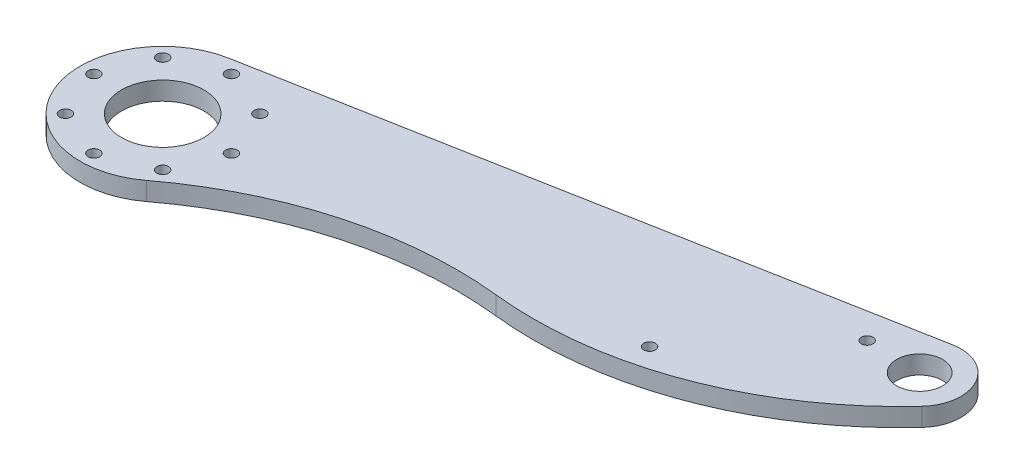
ISO-10303-21;
HEADER;
FILE_DESCRIPTION(('STEP AP214'),'2;1');
FILE_NAME('part.step','',(''),(''),'','','');
FILE_SCHEMA(('AUTOMOTIVE_DESIGN { 1 0 10303 214 1 1 1 1 }'));
ENDSEC;
DATA;
#1=APPLICATION_CONTEXT('core data for automotive mechanical design processes');
#2=APPLICATION_PROTOCOL_DEFINITION('international standard','automotive_design',2000,#1);
#3=PRODUCT_CONTEXT('',#1,'mechanical');
#4=PRODUCT('Part','Part','',(#3));
#5=PRODUCT_RELATED_PRODUCT_CATEGORY('part','',(#4));
#6=PRODUCT_DEFINITION_FORMATION('','',#4);
#7=PRODUCT_DEFINITION_CONTEXT('part definition',#1,'design');
#8=PRODUCT_DEFINITION('design','',#6,#7);
#9=PRODUCT_DEFINITION_SHAPE('','',#8);
#10=(LENGTH_UNIT() NAMED_UNIT(*) SI_UNIT(.MILLI.,.METRE.));
#11=(NAMED_UNIT(*) PLANE_ANGLE_UNIT() SI_UNIT($,.RADIAN.));
#12=(NAMED_UNIT(*) SI_UNIT($,.STERADIAN.) SOLID_ANGLE_UNIT());
#13=UNCERTAINTY_MEASURE_WITH_UNIT(LENGTH_MEASURE(1.E-05),#10,'distance_accuracy_value','');
#14=(GEOMETRIC_REPRESENTATION_CONTEXT(3) GLOBAL_UNCERTAINTY_ASSIGNED_CONTEXT((#13)) GLOBAL_UNIT_ASSIGNED_CONTEXT((#10,
#11,#12)) REPRESENTATION_CONTEXT('',''));
#15=CARTESIAN_POINT('',(0.,0.,0.));
#16=DIRECTION('',(0.,0.,1.));
#17=DIRECTION('',(1.,0.,0.));
#18=AXIS2_PLACEMENT_3D('',#15,#16,#17);
#19=CARTESIAN_POINT('',(586.595611400945,6.35,-953.504414342364));
#20=DIRECTION('',(0.,-1.,0.));
#21=DIRECTION('',(0.,0.,-1.));
#22=AXIS2_PLACEMENT_3D('',#19,#20,#21);
#23=CYLINDRICAL_SURFACE('',#22,133.350000000003);
#24=CARTESIAN_POINT('',(586.595611400945,0.,-953.504414342364));
#25=DIRECTION('',(0.,1.,0.));
#26=DIRECTION('',(0.,0.,1.));
#27=AXIS2_PLACEMENT_3D('',#24,#25,#26);
#28=CIRCLE('',#27,133.350000000003);
#29=CARTESIAN_POINT('',(600.970668220991,0.,-1086.0773385819));
#30=VERTEX_POINT('',#29);
#31=CARTESIAN_POINT('',(506.18157848252,0.,-1059.8801907663));
#32=VERTEX_POINT('',#31);
#33=EDGE_CURVE('E118',#30,#32,#28,.T.);
#34=ORIENTED_EDGE('',*,*,#33,.F.);
#35=DIRECTION('',(0.,-1.,0.));
#36=VECTOR('',#35,1.);
#37=CARTESIAN_POINT('',(600.970668220991,6.35,-1086.0773385819));
#38=LINE('',#37,#36);
#39=CARTESIAN_POINT('',(600.970668220991,6.35,-1086.0773385819));
#40=VERTEX_POINT('',#39);
#41=EDGE_CURVE('E11',#40,#30,#38,.T.);
#42=ORIENTED_EDGE('',*,*,#41,.F.);
#43=CARTESIAN_POINT('',(586.595611400945,6.35,-953.504414342364));
#44=DIRECTION('',(0.,1.,0.));
#45=DIRECTION('',(0.,0.,1.));
#46=AXIS2_PLACEMENT_3D('',#43,#44,#45);
#47=CIRCLE('',#46,133.350000000003);
#48=CARTESIAN_POINT('',(506.18157848252,6.35,-1059.8801907663));
#49=VERTEX_POINT('',#48);
#50=EDGE_CURVE('E375',#40,#49,#47,.T.);
#51=ORIENTED_EDGE('',*,*,#50,.T.);
#52=DIRECTION('',(0.,-1.,0.));
#53=VECTOR('',#52,1.);
#54=CARTESIAN_POINT('',(506.18157848252,6.35,-1059.8801907663));
#55=LINE('',#54,#53);
#56=EDGE_CURVE('E79',#49,#32,#55,.T.);
#57=ORIENTED_EDGE('',*,*,#56,.T.);
#58=EDGE_LOOP('',(#34,#42,#51,#57));
#59=FACE_BOUND('',#58,.T.);
#60=ADVANCED_FACE('F37',(#59),#23,.F.);
#61=CARTESIAN_POINT('',(614.661198525796,6.35,-1212.33726642907));
#62=DIRECTION('',(0.,-1.,0.));
#63=DIRECTION('',(0.,0.,-1.));
#64=AXIS2_PLACEMENT_3D('',#61,#62,#63);
#65=CYLINDRICAL_SURFACE('',#64,127.);
#66=CARTESIAN_POINT('',(614.661198525796,0.,-1212.33726642907));
#67=DIRECTION('',(0.,1.,0.));
#68=DIRECTION('',(0.,0.,1.));
#69=AXIS2_PLACEMENT_3D('',#66,#67,#68);
#70=CIRCLE('',#69,127.);
#71=CARTESIAN_POINT('',(708.209644565852,0.,-1126.44379610978));
#72=VERTEX_POINT('',#71);
#73=EDGE_CURVE('E121',#30,#72,#70,.T.);
#74=ORIENTED_EDGE('',*,*,#73,.T.);
#75=DIRECTION('',(0.,-1.,0.));
#76=VECTOR('',#75,1.);
#77=CARTESIAN_POINT('',(708.209644565852,6.35,-1126.44379610978));
#78=LINE('',#77,#76);
#79=CARTESIAN_POINT('',(708.209644565852,6.35,-1126.44379610978));
#80=VERTEX_POINT('',#79);
#81=EDGE_CURVE('E46',#80,#72,#78,.T.);
#82=ORIENTED_EDGE('',*,*,#81,.F.);
#83=CARTESIAN_POINT('',(614.661198525796,6.35,-1212.33726642907));
#84=DIRECTION('',(0.,1.,0.));
#85=DIRECTION('',(0.,0.,1.));
#86=AXIS2_PLACEMENT_3D('',#83,#84,#85);
#87=CIRCLE('',#86,127.);
#88=EDGE_CURVE('E93',#40,#80,#87,.T.);
#89=ORIENTED_EDGE('',*,*,#88,.F.);
#90=ORIENTED_EDGE('',*,*,#41,.T.);
#91=EDGE_LOOP('',(#74,#82,#89,#90));
#92=FACE_BOUND('',#91,.T.);
#93=ADVANCED_FACE('F133',(#92),#65,.T.);
#94=CARTESIAN_POINT('',(697.685444386345,6.35,-1136.1068115207));
#95=DIRECTION('',(0.,-1.,0.));
#96=DIRECTION('',(0.,0.,-1.));
#97=AXIS2_PLACEMENT_3D('',#94,#95,#96);
#98=CYLINDRICAL_SURFACE('',#97,14.2874999999999);
#99=CARTESIAN_POINT('',(697.685444386345,0.,-1136.1068115207));
#100=DIRECTION('',(0.,1.,0.));
#101=DIRECTION('',(0.,0.,1.));
#102=AXIS2_PLACEMENT_3D('',#99,#100,#101);
#103=CIRCLE('',#102,14.2874999999999);
#104=CARTESIAN_POINT('',(695.06799528282,0.,-1150.15250895587));
#105=VERTEX_POINT('',#104);
#106=EDGE_CURVE('E101',#72,#105,#103,.T.);
#107=ORIENTED_EDGE('',*,*,#106,.T.);
#108=DIRECTION('',(0.,-1.,0.));
#109=VECTOR('',#108,1.);
#110=CARTESIAN_POINT('',(695.06799528282,6.35,-1150.15250895587));
#111=LINE('',#110,#109);
#112=CARTESIAN_POINT('',(695.06799528282,6.35,-1150.15250895587));
#113=VERTEX_POINT('',#112);
#114=EDGE_CURVE('E99',#113,#105,#111,.T.);
#115=ORIENTED_EDGE('',*,*,#114,.F.);
#116=CARTESIAN_POINT('',(697.685444386345,6.35,-1136.1068115207));
#117=DIRECTION('',(0.,1.,0.));
#118=DIRECTION('',(0.,0.,1.));
#119=AXIS2_PLACEMENT_3D('',#116,#117,#118);
#120=CIRCLE('',#119,14.2874999999999);
#121=EDGE_CURVE('E88',#80,#113,#120,.T.);
#122=ORIENTED_EDGE('',*,*,#121,.F.);
#123=ORIENTED_EDGE('',*,*,#81,.T.);
#124=EDGE_LOOP('',(#107,#115,#122,#123));
#125=FACE_BOUND('',#124,.T.);
#126=ADVANCED_FACE('F100',(#125),#98,.T.);
#127=CARTESIAN_POINT('',(-183.81258487051,6.35,-986.371023754057));
#128=DIRECTION('',(-0.183198537429595,0.,-0.983075935970186));
#129=DIRECTION('',(-0.983075935970186,0.,0.183198537429595));
#130=AXIS2_PLACEMENT_3D('',#127,#128,#129);
#131=PLANE('',#130);
#132=DIRECTION('',(0.983075935970186,0.,-0.183198537429595));
#133=VECTOR('',#132,1.);
#134=CARTESIAN_POINT('',(-183.81258487051,0.,-986.371023754057));
#135=LINE('',#134,#133);
#136=CARTESIAN_POINT('',(483.715101792949,0.,-1110.76639487035));
#137=VERTEX_POINT('',#136);
#138=EDGE_CURVE('E125',#137,#105,#135,.T.);
#139=ORIENTED_EDGE('',*,*,#138,.F.);
#140=DIRECTION('',(0.,-1.,0.));
#141=VECTOR('',#140,1.);
#142=CARTESIAN_POINT('',(483.715101792949,6.35,-1110.76639487035));
#143=LINE('',#142,#141);
#144=CARTESIAN_POINT('',(483.715101792949,6.35,-1110.76639487035));
#145=VERTEX_POINT('',#144);
#146=EDGE_CURVE('E72',#145,#137,#143,.T.);
#147=ORIENTED_EDGE('',*,*,#146,.F.);
#148=DIRECTION('',(0.983075935970186,0.,-0.183198537429595));
#149=VECTOR('',#148,1.);
#150=CARTESIAN_POINT('',(-183.81258487051,6.35,-986.371023754057));
#151=LINE('',#150,#149);
#152=EDGE_CURVE('E92',#145,#113,#151,.T.);
#153=ORIENTED_EDGE('',*,*,#152,.T.);
#154=ORIENTED_EDGE('',*,*,#114,.T.);
#155=EDGE_LOOP('',(#139,#147,#153,#154));
#156=FACE_BOUND('',#155,.T.);
#157=ADVANCED_FACE('F106',(#156),#131,.T.);
#158=CARTESIAN_POINT('',(697.685444386345,6.35,-1136.1068115207));
#159=DIRECTION('',(0.,-1.,0.));
#160=DIRECTION('',(0.,0.,-1.));
#161=AXIS2_PLACEMENT_3D('',#158,#159,#160);
#162=CYLINDRICAL_SURFACE('',#161,7.93750000000277);
#163=CARTESIAN_POINT('',(697.685444386345,6.35,-1136.1068115207));
#164=DIRECTION('',(0.,1.,0.));
#165=DIRECTION('',(0.,0.,1.));
#166=AXIS2_PLACEMENT_3D('',#163,#164,#165);
#167=CIRCLE('',#166,7.93750000000277);
#168=CARTESIAN_POINT('',(697.685444386345,6.35,-1128.1693115207));
#169=VERTEX_POINT('',#168);
#170=EDGE_CURVE('E156',#169,#169,#167,.T.);
#171=ORIENTED_EDGE('',*,*,#170,.T.);
#172=EDGE_LOOP('',(#171));
#173=FACE_BOUND('',#172,.T.);
#174=CARTESIAN_POINT('',(697.685444386345,0.,-1136.1068115207));
#175=DIRECTION('',(0.,1.,0.));
#176=DIRECTION('',(0.,0.,1.));
#177=AXIS2_PLACEMENT_3D('',#174,#175,#176);
#178=CIRCLE('',#177,7.93750000000277);
#179=CARTESIAN_POINT('',(697.685444386345,0.,-1128.1693115207));
#180=VERTEX_POINT('',#179);
#181=EDGE_CURVE('E114',#180,#180,#178,.T.);
#182=ORIENTED_EDGE('',*,*,#181,.F.);
#183=EDGE_LOOP('',(#182));
#184=FACE_BOUND('',#183,.T.);
#185=ADVANCED_FACE('F143',(#173,#184),#162,.F.);
#186=CARTESIAN_POINT('',(488.95,6.35,-1082.675));
#187=DIRECTION('',(0.,-1.,0.));
#188=DIRECTION('',(0.,0.,-1.));
#189=AXIS2_PLACEMENT_3D('',#186,#187,#188);
#190=CYLINDRICAL_SURFACE('',#189,14.2875);
#191=CARTESIAN_POINT('',(488.95,6.35,-1082.675));
#192=DIRECTION('',(0.,1.,0.));
#193=DIRECTION('',(0.,0.,1.));
#194=AXIS2_PLACEMENT_3D('',#191,#192,#193);
#195=CIRCLE('',#194,14.2875);
#196=CARTESIAN_POINT('',(488.95,6.35,-1068.3875));
#197=VERTEX_POINT('',#196);
#198=EDGE_CURVE('E129',#197,#197,#195,.T.);
#199=ORIENTED_EDGE('',*,*,#198,.T.);
#200=EDGE_LOOP('',(#199));
#201=FACE_BOUND('',#200,.T.);
#202=CARTESIAN_POINT('',(488.95,0.,-1082.675));
#203=DIRECTION('',(0.,1.,0.));
#204=DIRECTION('',(0.,0.,1.));
#205=AXIS2_PLACEMENT_3D('',#202,#203,#204);
#206=CIRCLE('',#205,14.2875);
#207=CARTESIAN_POINT('',(488.95,0.,-1068.3875));
#208=VERTEX_POINT('',#207);
#209=EDGE_CURVE('E111',#208,#208,#206,.T.);
#210=ORIENTED_EDGE('',*,*,#209,.F.);
#211=EDGE_LOOP('',(#210));
#212=FACE_BOUND('',#211,.T.);
#213=ADVANCED_FACE('F39',(#201,#212),#190,.F.);
#214=CARTESIAN_POINT('',(488.95,6.35,-1082.675));
#215=DIRECTION('',(0.,-1.,0.));
#216=DIRECTION('',(0.,0.,-1.));
#217=AXIS2_PLACEMENT_3D('',#214,#215,#216);
#218=CYLINDRICAL_SURFACE('',#217,28.5750000000001);
#219=CARTESIAN_POINT('',(488.95,0.,-1082.675));
#220=DIRECTION('',(0.,1.,0.));
#221=DIRECTION('',(0.,0.,1.));
#222=AXIS2_PLACEMENT_3D('',#219,#220,#221);
#223=CIRCLE('',#222,28.5750000000001);
#224=EDGE_CURVE('E127',#137,#32,#223,.T.);
#225=ORIENTED_EDGE('',*,*,#224,.T.);
#226=ORIENTED_EDGE('',*,*,#56,.F.);
#227=CARTESIAN_POINT('',(488.95,6.35,-1082.675));
#228=DIRECTION('',(0.,1.,0.));
#229=DIRECTION('',(0.,0.,1.));
#230=AXIS2_PLACEMENT_3D('',#227,#228,#229);
#231=CIRCLE('',#230,28.5750000000001);
#232=EDGE_CURVE('E54',#145,#49,#231,.T.);
#233=ORIENTED_EDGE('',*,*,#232,.F.);
#234=ORIENTED_EDGE('',*,*,#146,.T.);
#235=EDGE_LOOP('',(#225,#226,#233,#234));
#236=FACE_BOUND('',#235,.T.);
#237=ADVANCED_FACE('F150',(#236),#218,.T.);
#238=CARTESIAN_POINT('',(0.,6.35,0.));
#239=DIRECTION('',(0.,1.,0.));
#240=DIRECTION('',(0.,0.,1.));
#241=AXIS2_PLACEMENT_3D('',#238,#239,#240);
#242=PLANE('',#241);
#243=CARTESIAN_POINT('',(488.95,6.35,-1058.8625));
#244=DIRECTION('',(0.,1.,0.));
#245=DIRECTION('',(0.,0.,1.));
#246=AXIS2_PLACEMENT_3D('',#243,#244,#245);
#247=CIRCLE('',#246,2.01929999999996);
#248=CARTESIAN_POINT('',(488.95,6.35,-1056.8432));
#249=VERTEX_POINT('',#248);
#250=EDGE_CURVE('E314',#249,#249,#247,.T.);
#251=ORIENTED_EDGE('',*,*,#250,.F.);
#252=EDGE_LOOP('',(#251));
#253=FACE_BOUND('',#252,.T.);
#254=CARTESIAN_POINT('',(643.114305474491,6.35,-1097.12171037684));
#255=DIRECTION('',(0.,1.,0.));
#256=DIRECTION('',(0.,0.,1.));
#257=AXIS2_PLACEMENT_3D('',#254,#255,#256);
#258=CIRCLE('',#257,2.01929999999989);
#259=CARTESIAN_POINT('',(643.114305474491,6.35,-1095.10241037684));
#260=VERTEX_POINT('',#259);
#261=EDGE_CURVE('E326',#260,#260,#258,.T.);
#262=ORIENTED_EDGE('',*,*,#261,.F.);
#263=EDGE_LOOP('',(#262));
#264=FACE_BOUND('',#263,.T.);
#265=CARTESIAN_POINT('',(505.787980227008,6.35,-1065.837019773));
#266=DIRECTION('',(0.,1.,0.));
#267=DIRECTION('',(0.,0.,1.));
#268=AXIS2_PLACEMENT_3D('',#265,#266,#267);
#269=CIRCLE('',#268,2.01929999999989);
#270=CARTESIAN_POINT('',(505.787980227008,6.35,-1063.817719773));
#271=VERTEX_POINT('',#270);
#272=EDGE_CURVE('E319',#271,#271,#269,.T.);
#273=ORIENTED_EDGE('',*,*,#272,.F.);
#274=EDGE_LOOP('',(#273));
#275=FACE_BOUND('',#274,.T.);
#276=CARTESIAN_POINT('',(512.762500000002,6.35,-1082.675));
#277=DIRECTION('',(0.,1.,0.));
#278=DIRECTION('',(0.,0.,1.));
#279=AXIS2_PLACEMENT_3D('',#276,#277,#278);
#280=CIRCLE('',#279,2.01929999999989);
#281=CARTESIAN_POINT('',(512.762500000002,6.35,-1080.6557));
#282=VERTEX_POINT('',#281);
#283=EDGE_CURVE('E358',#282,#282,#280,.T.);
#284=ORIENTED_EDGE('',*,*,#283,.F.);
#285=EDGE_LOOP('',(#284));
#286=FACE_BOUND('',#285,.T.);
#287=CARTESIAN_POINT('',(505.787980227005,6.35,-1099.51298022701));
#288=DIRECTION('',(0.,1.,0.));
#289=DIRECTION('',(0.,0.,1.));
#290=AXIS2_PLACEMENT_3D('',#287,#288,#289);
#291=CIRCLE('',#290,2.01929999999989);
#292=CARTESIAN_POINT('',(505.787980227005,6.35,-1097.49368022701));
#293=VERTEX_POINT('',#292);
#294=EDGE_CURVE('E364',#293,#293,#291,.T.);
#295=ORIENTED_EDGE('',*,*,#294,.F.);
#296=EDGE_LOOP('',(#295));
#297=FACE_BOUND('',#296,.T.);
#298=CARTESIAN_POINT('',(488.95,6.35,-1106.4875));
#299=DIRECTION('',(0.,1.,0.));
#300=DIRECTION('',(0.,0.,1.));
#301=AXIS2_PLACEMENT_3D('',#298,#299,#300);
#302=CIRCLE('',#301,2.01930000000005);
#303=CARTESIAN_POINT('',(488.95,6.35,-1104.4682));
#304=VERTEX_POINT('',#303);
#305=EDGE_CURVE('E344',#304,#304,#302,.T.);
#306=ORIENTED_EDGE('',*,*,#305,.F.);
#307=EDGE_LOOP('',(#306));
#308=FACE_BOUND('',#307,.T.);
#309=CARTESIAN_POINT('',(678.962907861809,6.35,-1136.62395425774));
#310=DIRECTION('',(0.,1.,0.));
#311=DIRECTION('',(0.,0.,1.));
#312=AXIS2_PLACEMENT_3D('',#309,#310,#311);
#313=CIRCLE('',#312,2.01929999999989);
#314=CARTESIAN_POINT('',(678.962907861809,6.35,-1134.60465425774));
#315=VERTEX_POINT('',#314);
#316=EDGE_CURVE('E325',#315,#315,#313,.T.);
#317=ORIENTED_EDGE('',*,*,#316,.F.);
#318=EDGE_LOOP('',(#317));
#319=FACE_BOUND('',#318,.T.);
#320=CARTESIAN_POINT('',(472.112019772998,6.35,-1065.83701977299));
#321=DIRECTION('',(0.,1.,0.));
#322=DIRECTION('',(0.,0.,1.));
#323=AXIS2_PLACEMENT_3D('',#320,#321,#322);
#324=CIRCLE('',#323,2.01930000000001);
#325=CARTESIAN_POINT('',(472.112019772998,6.35,-1063.81771977299));
#326=VERTEX_POINT('',#325);
#327=EDGE_CURVE('E333',#326,#326,#324,.T.);
#328=ORIENTED_EDGE('',*,*,#327,.F.);
#329=EDGE_LOOP('',(#328));
#330=FACE_BOUND('',#329,.T.);
#331=CARTESIAN_POINT('',(465.1375,6.35,-1082.675));
#332=DIRECTION('',(0.,1.,0.));
#333=DIRECTION('',(0.,0.,1.));
#334=AXIS2_PLACEMENT_3D('',#331,#332,#333);
#335=CIRCLE('',#334,2.01930000000012);
#336=CARTESIAN_POINT('',(465.1375,6.35,-1080.6557));
#337=VERTEX_POINT('',#336);
#338=EDGE_CURVE('E332',#337,#337,#335,.T.);
#339=ORIENTED_EDGE('',*,*,#338,.F.);
#340=EDGE_LOOP('',(#339));
#341=FACE_BOUND('',#340,.T.);
#342=CARTESIAN_POINT('',(472.112019772996,6.35,-1099.512980227));
#343=DIRECTION('',(0.,1.,0.));
#344=DIRECTION('',(0.,0.,1.));
#345=AXIS2_PLACEMENT_3D('',#342,#343,#344);
#346=CIRCLE('',#345,2.01930000000001);
#347=CARTESIAN_POINT('',(472.112019772996,6.35,-1097.493680227));
#348=VERTEX_POINT('',#347);
#349=EDGE_CURVE('E345',#348,#348,#346,.T.);
#350=ORIENTED_EDGE('',*,*,#349,.F.);
#351=EDGE_LOOP('',(#350));
#352=FACE_BOUND('',#351,.T.);
#353=ORIENTED_EDGE('',*,*,#198,.F.);
#354=EDGE_LOOP('',(#353));
#355=FACE_BOUND('',#354,.T.);
#356=ORIENTED_EDGE('',*,*,#170,.F.);
#357=EDGE_LOOP('',(#356));
#358=FACE_BOUND('',#357,.T.);
#359=ORIENTED_EDGE('',*,*,#50,.F.);
#360=ORIENTED_EDGE('',*,*,#88,.T.);
#361=ORIENTED_EDGE('',*,*,#121,.T.);
#362=ORIENTED_EDGE('',*,*,#152,.F.);
#363=ORIENTED_EDGE('',*,*,#232,.T.);
#364=EDGE_LOOP('',(#359,#360,#361,#362,#363));
#365=FACE_BOUND('',#364,.T.);
#366=ADVANCED_FACE('F90',(#253,#264,#275,#286,#297,#308,#319,#330,#341,#352,#355,#358,#365),
#242,.T.);
#367=CARTESIAN_POINT('',(0.,0.,0.));
#368=DIRECTION('',(0.,1.,0.));
#369=DIRECTION('',(0.,0.,1.));
#370=AXIS2_PLACEMENT_3D('',#367,#368,#369);
#371=PLANE('',#370);
#372=CARTESIAN_POINT('',(488.95,0.,-1058.8625));
#373=DIRECTION('',(0.,1.,0.));
#374=DIRECTION('',(0.,0.,1.));
#375=AXIS2_PLACEMENT_3D('',#372,#373,#374);
#376=CIRCLE('',#375,2.01929999999996);
#377=CARTESIAN_POINT('',(488.95,0.,-1056.8432));
#378=VERTEX_POINT('',#377);
#379=EDGE_CURVE('E115',#378,#378,#376,.T.);
#380=ORIENTED_EDGE('',*,*,#379,.T.);
#381=EDGE_LOOP('',(#380));
#382=FACE_BOUND('',#381,.T.);
#383=CARTESIAN_POINT('',(643.114305474491,0.,-1097.12171037684));
#384=DIRECTION('',(0.,1.,0.));
#385=DIRECTION('',(0.,0.,1.));
#386=AXIS2_PLACEMENT_3D('',#383,#384,#385);
#387=CIRCLE('',#386,2.01929999999989);
#388=CARTESIAN_POINT('',(643.114305474491,0.,-1095.10241037684));
#389=VERTEX_POINT('',#388);
#390=EDGE_CURVE('E322',#389,#389,#387,.T.);
#391=ORIENTED_EDGE('',*,*,#390,.T.);
#392=EDGE_LOOP('',(#391));
#393=FACE_BOUND('',#392,.T.);
#394=CARTESIAN_POINT('',(505.787980227008,0.,-1065.837019773));
#395=DIRECTION('',(0.,1.,0.));
#396=DIRECTION('',(0.,0.,1.));
#397=AXIS2_PLACEMENT_3D('',#394,#395,#396);
#398=CIRCLE('',#397,2.01929999999989);
#399=CARTESIAN_POINT('',(505.787980227008,0.,-1063.817719773));
#400=VERTEX_POINT('',#399);
#401=EDGE_CURVE('E315',#400,#400,#398,.T.);
#402=ORIENTED_EDGE('',*,*,#401,.T.);
#403=EDGE_LOOP('',(#402));
#404=FACE_BOUND('',#403,.T.);
#405=CARTESIAN_POINT('',(512.762500000002,0.,-1082.675));
#406=DIRECTION('',(0.,1.,0.));
#407=DIRECTION('',(0.,0.,1.));
#408=AXIS2_PLACEMENT_3D('',#405,#406,#407);
#409=CIRCLE('',#408,2.01929999999989);
#410=CARTESIAN_POINT('',(512.762500000002,0.,-1080.6557));
#411=VERTEX_POINT('',#410);
#412=EDGE_CURVE('E355',#411,#411,#409,.T.);
#413=ORIENTED_EDGE('',*,*,#412,.T.);
#414=EDGE_LOOP('',(#413));
#415=FACE_BOUND('',#414,.T.);
#416=CARTESIAN_POINT('',(505.787980227005,0.,-1099.51298022701));
#417=DIRECTION('',(0.,1.,0.));
#418=DIRECTION('',(0.,0.,1.));
#419=AXIS2_PLACEMENT_3D('',#416,#417,#418);
#420=CIRCLE('',#419,2.01929999999989);
#421=CARTESIAN_POINT('',(505.787980227005,0.,-1097.49368022701));
#422=VERTEX_POINT('',#421);
#423=EDGE_CURVE('E361',#422,#422,#420,.T.);
#424=ORIENTED_EDGE('',*,*,#423,.T.);
#425=EDGE_LOOP('',(#424));
#426=FACE_BOUND('',#425,.T.);
#427=CARTESIAN_POINT('',(488.95,0.,-1106.4875));
#428=DIRECTION('',(0.,1.,0.));
#429=DIRECTION('',(0.,0.,1.));
#430=AXIS2_PLACEMENT_3D('',#427,#428,#429);
#431=CIRCLE('',#430,2.01930000000005);
#432=CARTESIAN_POINT('',(488.95,0.,-1104.4682));
#433=VERTEX_POINT('',#432);
#434=EDGE_CURVE('E367',#433,#433,#431,.T.);
#435=ORIENTED_EDGE('',*,*,#434,.T.);
#436=EDGE_LOOP('',(#435));
#437=FACE_BOUND('',#436,.T.);
#438=CARTESIAN_POINT('',(678.962907861809,0.,-1136.62395425774));
#439=DIRECTION('',(0.,1.,0.));
#440=DIRECTION('',(0.,0.,1.));
#441=AXIS2_PLACEMENT_3D('',#438,#439,#440);
#442=CIRCLE('',#441,2.01929999999989);
#443=CARTESIAN_POINT('',(678.962907861809,0.,-1134.60465425774));
#444=VERTEX_POINT('',#443);
#445=EDGE_CURVE('E336',#444,#444,#442,.T.);
#446=ORIENTED_EDGE('',*,*,#445,.T.);
#447=EDGE_LOOP('',(#446));
#448=FACE_BOUND('',#447,.T.);
#449=CARTESIAN_POINT('',(472.112019772998,0.,-1065.83701977299));
#450=DIRECTION('',(0.,1.,0.));
#451=DIRECTION('',(0.,0.,1.));
#452=AXIS2_PLACEMENT_3D('',#449,#450,#451);
#453=CIRCLE('',#452,2.01930000000001);
#454=CARTESIAN_POINT('',(472.112019772998,0.,-1063.81771977299));
#455=VERTEX_POINT('',#454);
#456=EDGE_CURVE('E329',#455,#455,#453,.T.);
#457=ORIENTED_EDGE('',*,*,#456,.T.);
#458=EDGE_LOOP('',(#457));
#459=FACE_BOUND('',#458,.T.);
#460=CARTESIAN_POINT('',(465.1375,0.,-1082.675));
#461=DIRECTION('',(0.,1.,0.));
#462=DIRECTION('',(0.,0.,1.));
#463=AXIS2_PLACEMENT_3D('',#460,#461,#462);
#464=CIRCLE('',#463,2.01930000000012);
#465=CARTESIAN_POINT('',(465.1375,0.,-1080.6557));
#466=VERTEX_POINT('',#465);
#467=EDGE_CURVE('E348',#466,#466,#464,.T.);
#468=ORIENTED_EDGE('',*,*,#467,.T.);
#469=EDGE_LOOP('',(#468));
#470=FACE_BOUND('',#469,.T.);
#471=CARTESIAN_POINT('',(472.112019772996,0.,-1099.512980227));
#472=DIRECTION('',(0.,1.,0.));
#473=DIRECTION('',(0.,0.,1.));
#474=AXIS2_PLACEMENT_3D('',#471,#472,#473);
#475=CIRCLE('',#474,2.01930000000001);
#476=CARTESIAN_POINT('',(472.112019772996,0.,-1097.493680227));
#477=VERTEX_POINT('',#476);
#478=EDGE_CURVE('E341',#477,#477,#475,.T.);
#479=ORIENTED_EDGE('',*,*,#478,.T.);
#480=EDGE_LOOP('',(#479));
#481=FACE_BOUND('',#480,.T.);
#482=ORIENTED_EDGE('',*,*,#209,.T.);
#483=EDGE_LOOP('',(#482));
#484=FACE_BOUND('',#483,.T.);
#485=ORIENTED_EDGE('',*,*,#181,.T.);
#486=EDGE_LOOP('',(#485));
#487=FACE_BOUND('',#486,.T.);
#488=ORIENTED_EDGE('',*,*,#33,.T.);
#489=ORIENTED_EDGE('',*,*,#224,.F.);
#490=ORIENTED_EDGE('',*,*,#138,.T.);
#491=ORIENTED_EDGE('',*,*,#106,.F.);
#492=ORIENTED_EDGE('',*,*,#73,.F.);
#493=EDGE_LOOP('',(#488,#489,#490,#491,#492));
#494=FACE_BOUND('',#493,.T.);
#495=ADVANCED_FACE('F135',(#382,#393,#404,#415,#426,#437,#448,#459,#470,#481,#484,#487,#494),
#371,.F.);
#496=CARTESIAN_POINT('',(472.112019772996,0.,-1099.512980227));
#497=DIRECTION('',(0.,1.,0.));
#498=DIRECTION('',(0.,0.,1.));
#499=AXIS2_PLACEMENT_3D('',#496,#497,#498);
#500=CYLINDRICAL_SURFACE('',#499,2.01930000000001);
#501=ORIENTED_EDGE('',*,*,#478,.F.);
#502=EDGE_LOOP('',(#501));
#503=FACE_BOUND('',#502,.T.);
#504=ORIENTED_EDGE('',*,*,#349,.T.);
#505=EDGE_LOOP('',(#504));
#506=FACE_BOUND('',#505,.T.);
#507=ADVANCED_FACE('F160',(#503,#506),#500,.F.);
#508=CARTESIAN_POINT('',(465.1375,0.,-1082.675));
#509=DIRECTION('',(0.,1.,0.));
#510=DIRECTION('',(0.,0.,1.));
#511=AXIS2_PLACEMENT_3D('',#508,#509,#510);
#512=CYLINDRICAL_SURFACE('',#511,2.01930000000012);
#513=ORIENTED_EDGE('',*,*,#467,.F.);
#514=EDGE_LOOP('',(#513));
#515=FACE_BOUND('',#514,.T.);
#516=ORIENTED_EDGE('',*,*,#338,.T.);
#517=EDGE_LOOP('',(#516));
#518=FACE_BOUND('',#517,.T.);
#519=ADVANCED_FACE('F167',(#515,#518),#512,.F.);
#520=CARTESIAN_POINT('',(472.112019772998,0.,-1065.83701977299));
#521=DIRECTION('',(0.,1.,0.));
#522=DIRECTION('',(0.,0.,1.));
#523=AXIS2_PLACEMENT_3D('',#520,#521,#522);
#524=CYLINDRICAL_SURFACE('',#523,2.01930000000001);
#525=ORIENTED_EDGE('',*,*,#456,.F.);
#526=EDGE_LOOP('',(#525));
#527=FACE_BOUND('',#526,.T.);
#528=ORIENTED_EDGE('',*,*,#327,.T.);
#529=EDGE_LOOP('',(#528));
#530=FACE_BOUND('',#529,.T.);
#531=ADVANCED_FACE('F227',(#527,#530),#524,.F.);
#532=CARTESIAN_POINT('',(678.962907861809,0.,-1136.62395425774));
#533=DIRECTION('',(0.,1.,0.));
#534=DIRECTION('',(0.,0.,1.));
#535=AXIS2_PLACEMENT_3D('',#532,#533,#534);
#536=CYLINDRICAL_SURFACE('',#535,2.01929999999989);
#537=ORIENTED_EDGE('',*,*,#445,.F.);
#538=EDGE_LOOP('',(#537));
#539=FACE_BOUND('',#538,.T.);
#540=ORIENTED_EDGE('',*,*,#316,.T.);
#541=EDGE_LOOP('',(#540));
#542=FACE_BOUND('',#541,.T.);
#543=ADVANCED_FACE('F237',(#539,#542),#536,.F.);
#544=CARTESIAN_POINT('',(488.95,0.,-1106.4875));
#545=DIRECTION('',(0.,1.,0.));
#546=DIRECTION('',(0.,0.,1.));
#547=AXIS2_PLACEMENT_3D('',#544,#545,#546);
#548=CYLINDRICAL_SURFACE('',#547,2.01930000000005);
#549=ORIENTED_EDGE('',*,*,#434,.F.);
#550=EDGE_LOOP('',(#549));
#551=FACE_BOUND('',#550,.T.);
#552=ORIENTED_EDGE('',*,*,#305,.T.);
#553=EDGE_LOOP('',(#552));
#554=FACE_BOUND('',#553,.T.);
#555=ADVANCED_FACE('F247',(#551,#554),#548,.F.);
#556=CARTESIAN_POINT('',(505.787980227005,0.,-1099.51298022701));
#557=DIRECTION('',(0.,1.,0.));
#558=DIRECTION('',(0.,0.,1.));
#559=AXIS2_PLACEMENT_3D('',#556,#557,#558);
#560=CYLINDRICAL_SURFACE('',#559,2.01929999999989);
#561=ORIENTED_EDGE('',*,*,#423,.F.);
#562=EDGE_LOOP('',(#561));
#563=FACE_BOUND('',#562,.T.);
#564=ORIENTED_EDGE('',*,*,#294,.T.);
#565=EDGE_LOOP('',(#564));
#566=FACE_BOUND('',#565,.T.);
#567=ADVANCED_FACE('F257',(#563,#566),#560,.F.);
#568=CARTESIAN_POINT('',(512.762500000002,0.,-1082.675));
#569=DIRECTION('',(0.,1.,0.));
#570=DIRECTION('',(0.,0.,1.));
#571=AXIS2_PLACEMENT_3D('',#568,#569,#570);
#572=CYLINDRICAL_SURFACE('',#571,2.01929999999989);
#573=ORIENTED_EDGE('',*,*,#412,.F.);
#574=EDGE_LOOP('',(#573));
#575=FACE_BOUND('',#574,.T.);
#576=ORIENTED_EDGE('',*,*,#283,.T.);
#577=EDGE_LOOP('',(#576));
#578=FACE_BOUND('',#577,.T.);
#579=ADVANCED_FACE('F266',(#575,#578),#572,.F.);
#580=CARTESIAN_POINT('',(505.787980227008,0.,-1065.837019773));
#581=DIRECTION('',(0.,1.,0.));
#582=DIRECTION('',(0.,0.,1.));
#583=AXIS2_PLACEMENT_3D('',#580,#581,#582);
#584=CYLINDRICAL_SURFACE('',#583,2.01929999999989);
#585=ORIENTED_EDGE('',*,*,#401,.F.);
#586=EDGE_LOOP('',(#585));
#587=FACE_BOUND('',#586,.T.);
#588=ORIENTED_EDGE('',*,*,#272,.T.);
#589=EDGE_LOOP('',(#588));
#590=FACE_BOUND('',#589,.T.);
#591=ADVANCED_FACE('F276',(#587,#590),#584,.F.);
#592=CARTESIAN_POINT('',(643.114305474491,0.,-1097.12171037684));
#593=DIRECTION('',(0.,1.,0.));
#594=DIRECTION('',(0.,0.,1.));
#595=AXIS2_PLACEMENT_3D('',#592,#593,#594);
#596=CYLINDRICAL_SURFACE('',#595,2.01929999999989);
#597=ORIENTED_EDGE('',*,*,#390,.F.);
#598=EDGE_LOOP('',(#597));
#599=FACE_BOUND('',#598,.T.);
#600=ORIENTED_EDGE('',*,*,#261,.T.);
#601=EDGE_LOOP('',(#600));
#602=FACE_BOUND('',#601,.T.);
#603=ADVANCED_FACE('F286',(#599,#602),#596,.F.);
#604=CARTESIAN_POINT('',(488.95,0.,-1058.8625));
#605=DIRECTION('',(0.,1.,0.));
#606=DIRECTION('',(0.,0.,1.));
#607=AXIS2_PLACEMENT_3D('',#604,#605,#606);
#608=CYLINDRICAL_SURFACE('',#607,2.01929999999996);
#609=ORIENTED_EDGE('',*,*,#379,.F.);
#610=EDGE_LOOP('',(#609));
#611=FACE_BOUND('',#610,.T.);
#612=ORIENTED_EDGE('',*,*,#250,.T.);
#613=EDGE_LOOP('',(#612));
#614=FACE_BOUND('',#613,.T.);
#615=ADVANCED_FACE('F296',(#611,#614),#608,.F.);
#616=CLOSED_SHELL('',(#60,#93,#126,#157,#185,#213,#237,#366,#495,#507,#519,#531,#543,#555,#567,
#579,#591,#603,#615));
#617=MANIFOLD_SOLID_BREP('B2',#616);
#618=ADVANCED_BREP_SHAPE_REPRESENTATION('',(#18,#617),#14);
#619=SHAPE_DEFINITION_REPRESENTATION(#9,#618);
ENDSEC;
END-ISO-10303-21;
